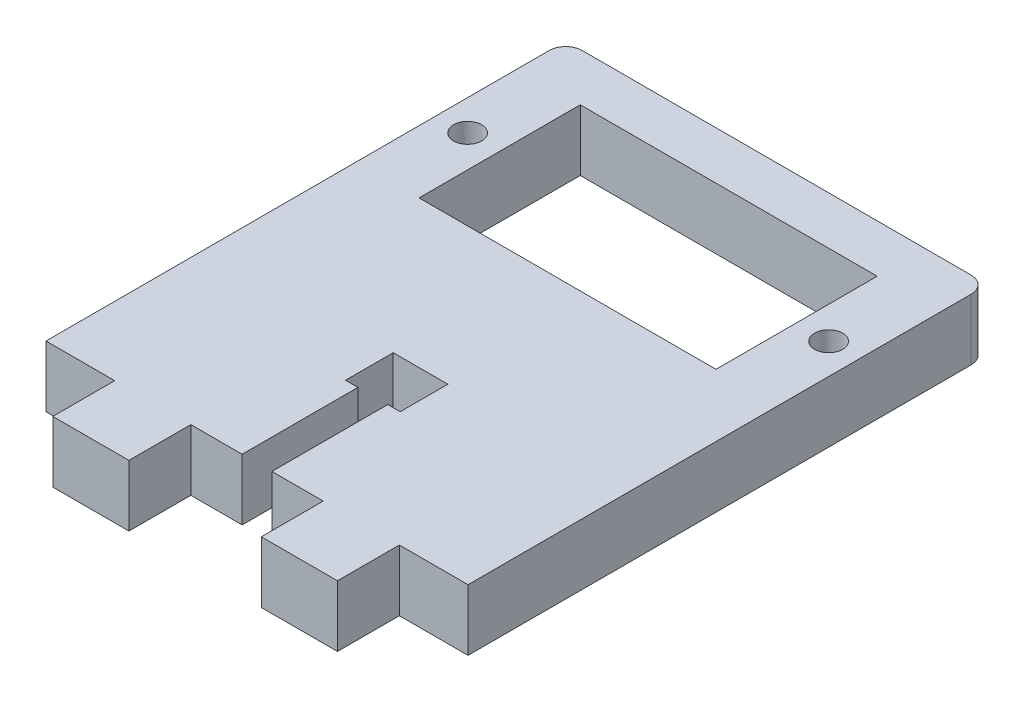
ISO-10303-21;
HEADER;
FILE_DESCRIPTION(('STEP AP214'),'2;1');
FILE_NAME('part.step','',(''),(''),'','','');
FILE_SCHEMA(('AUTOMOTIVE_DESIGN { 1 0 10303 214 1 1 1 1 }'));
ENDSEC;
DATA;
#1=APPLICATION_CONTEXT('core data for automotive mechanical design processes');
#2=APPLICATION_PROTOCOL_DEFINITION('international standard','automotive_design',2000,#1);
#3=PRODUCT_CONTEXT('',#1,'mechanical');
#4=PRODUCT('Part','Part','',(#3));
#5=PRODUCT_RELATED_PRODUCT_CATEGORY('part','',(#4));
#6=PRODUCT_DEFINITION_FORMATION('','',#4);
#7=PRODUCT_DEFINITION_CONTEXT('part definition',#1,'design');
#8=PRODUCT_DEFINITION('design','',#6,#7);
#9=PRODUCT_DEFINITION_SHAPE('','',#8);
#10=(LENGTH_UNIT() NAMED_UNIT(*) SI_UNIT(.MILLI.,.METRE.));
#11=(NAMED_UNIT(*) PLANE_ANGLE_UNIT() SI_UNIT($,.RADIAN.));
#12=(NAMED_UNIT(*) SI_UNIT($,.STERADIAN.) SOLID_ANGLE_UNIT());
#13=UNCERTAINTY_MEASURE_WITH_UNIT(LENGTH_MEASURE(1.E-05),#10,'distance_accuracy_value','');
#14=(GEOMETRIC_REPRESENTATION_CONTEXT(3) GLOBAL_UNCERTAINTY_ASSIGNED_CONTEXT((#13)) GLOBAL_UNIT_ASSIGNED_CONTEXT((#10,
#11,#12)) REPRESENTATION_CONTEXT('',''));
#15=CARTESIAN_POINT('',(0.,0.,0.));
#16=DIRECTION('',(0.,0.,1.));
#17=DIRECTION('',(1.,0.,0.));
#18=AXIS2_PLACEMENT_3D('',#15,#16,#17);
#19=CARTESIAN_POINT('',(-16.1925,4.699,19.939));
#20=DIRECTION('',(0.,0.,-1.));
#21=DIRECTION('',(-1.,0.,0.));
#22=AXIS2_PLACEMENT_3D('',#19,#20,#21);
#23=PLANE('',#22);
#24=DIRECTION('',(0.,1.,0.));
#25=VECTOR('',#24,1.);
#26=CARTESIAN_POINT('',(-1.143,0.,19.939));
#27=LINE('',#26,#25);
#28=CARTESIAN_POINT('',(-1.143,0.,19.939));
#29=VERTEX_POINT('',#28);
#30=CARTESIAN_POINT('',(-1.143,4.699,19.939));
#31=VERTEX_POINT('',#30);
#32=EDGE_CURVE('E370',#29,#31,#27,.T.);
#33=ORIENTED_EDGE('',*,*,#32,.T.);
#34=DIRECTION('',(1.,0.,0.));
#35=VECTOR('',#34,1.);
#36=CARTESIAN_POINT('',(-16.1925,4.699,19.939));
#37=LINE('',#36,#35);
#38=CARTESIAN_POINT('',(-5.08,4.699,19.939));
#39=VERTEX_POINT('',#38);
#40=EDGE_CURVE('E503',#39,#31,#37,.T.);
#41=ORIENTED_EDGE('',*,*,#40,.F.);
#42=DIRECTION('',(0.,-1.,0.));
#43=VECTOR('',#42,1.);
#44=CARTESIAN_POINT('',(-5.08,4.699,19.939));
#45=LINE('',#44,#43);
#46=CARTESIAN_POINT('',(-5.08,0.,19.939));
#47=VERTEX_POINT('',#46);
#48=EDGE_CURVE('E414',#39,#47,#45,.T.);
#49=ORIENTED_EDGE('',*,*,#48,.T.);
#50=DIRECTION('',(1.,0.,0.));
#51=VECTOR('',#50,1.);
#52=CARTESIAN_POINT('',(-16.1925,0.,19.939));
#53=LINE('',#52,#51);
#54=EDGE_CURVE('E521',#47,#29,#53,.T.);
#55=ORIENTED_EDGE('',*,*,#54,.T.);
#56=EDGE_LOOP('',(#33,#41,#49,#55));
#57=FACE_BOUND('',#56,.T.);
#58=ADVANCED_FACE('F110',(#57),#23,.F.);
#59=CARTESIAN_POINT('',(-10.922,4.699,0.));
#60=DIRECTION('',(1.,0.,0.));
#61=DIRECTION('',(0.,0.,-1.));
#62=AXIS2_PLACEMENT_3D('',#59,#60,#61);
#63=PLANE('',#62);
#64=DIRECTION('',(0.,0.,1.));
#65=VECTOR('',#64,1.);
#66=CARTESIAN_POINT('',(-10.922,0.,0.));
#67=LINE('',#66,#65);
#68=CARTESIAN_POINT('',(-10.922,0.,19.939));
#69=VERTEX_POINT('',#68);
#70=CARTESIAN_POINT('',(-10.922,0.,24.6888));
#71=VERTEX_POINT('',#70);
#72=EDGE_CURVE('E398',#69,#71,#67,.T.);
#73=ORIENTED_EDGE('',*,*,#72,.T.);
#74=DIRECTION('',(0.,-1.,0.));
#75=VECTOR('',#74,1.);
#76=CARTESIAN_POINT('',(-10.922,4.699,24.6888));
#77=LINE('',#76,#75);
#78=CARTESIAN_POINT('',(-10.922,4.699,24.6888));
#79=VERTEX_POINT('',#78);
#80=EDGE_CURVE('E407',#79,#71,#77,.T.);
#81=ORIENTED_EDGE('',*,*,#80,.F.);
#82=DIRECTION('',(0.,0.,1.));
#83=VECTOR('',#82,1.);
#84=CARTESIAN_POINT('',(-10.922,4.699,0.));
#85=LINE('',#84,#83);
#86=CARTESIAN_POINT('',(-10.922,4.699,19.939));
#87=VERTEX_POINT('',#86);
#88=EDGE_CURVE('E386',#87,#79,#85,.T.);
#89=ORIENTED_EDGE('',*,*,#88,.F.);
#90=DIRECTION('',(0.,-1.,0.));
#91=VECTOR('',#90,1.);
#92=CARTESIAN_POINT('',(-10.922,4.699,19.939));
#93=LINE('',#92,#91);
#94=EDGE_CURVE('E411',#87,#69,#93,.T.);
#95=ORIENTED_EDGE('',*,*,#94,.T.);
#96=EDGE_LOOP('',(#73,#81,#89,#95));
#97=FACE_BOUND('',#96,.T.);
#98=ADVANCED_FACE('F595',(#97),#63,.F.);
#99=CARTESIAN_POINT('',(0.,4.699,24.6888));
#100=DIRECTION('',(0.,0.,-1.));
#101=DIRECTION('',(-1.,0.,0.));
#102=AXIS2_PLACEMENT_3D('',#99,#100,#101);
#103=PLANE('',#102);
#104=DIRECTION('',(1.,0.,0.));
#105=VECTOR('',#104,1.);
#106=CARTESIAN_POINT('',(0.,0.,24.6888));
#107=LINE('',#106,#105);
#108=CARTESIAN_POINT('',(-5.08,0.,24.6888));
#109=VERTEX_POINT('',#108);
#110=EDGE_CURVE('E387',#71,#109,#107,.T.);
#111=ORIENTED_EDGE('',*,*,#110,.T.);
#112=DIRECTION('',(0.,-1.,0.));
#113=VECTOR('',#112,1.);
#114=CARTESIAN_POINT('',(-5.08,4.699,24.6888));
#115=LINE('',#114,#113);
#116=CARTESIAN_POINT('',(-5.08,4.699,24.6888));
#117=VERTEX_POINT('',#116);
#118=EDGE_CURVE('E393',#117,#109,#115,.T.);
#119=ORIENTED_EDGE('',*,*,#118,.F.);
#120=DIRECTION('',(1.,0.,0.));
#121=VECTOR('',#120,1.);
#122=CARTESIAN_POINT('',(0.,4.699,24.6888));
#123=LINE('',#122,#121);
#124=EDGE_CURVE('E390',#79,#117,#123,.T.);
#125=ORIENTED_EDGE('',*,*,#124,.F.);
#126=ORIENTED_EDGE('',*,*,#80,.T.);
#127=EDGE_LOOP('',(#111,#119,#125,#126));
#128=FACE_BOUND('',#127,.T.);
#129=ADVANCED_FACE('F589',(#128),#103,.F.);
#130=CARTESIAN_POINT('',(-5.08000000000001,4.699,0.));
#131=DIRECTION('',(1.,0.,0.));
#132=DIRECTION('',(0.,0.,-1.));
#133=AXIS2_PLACEMENT_3D('',#130,#131,#132);
#134=PLANE('',#133);
#135=DIRECTION('',(0.,0.,1.));
#136=VECTOR('',#135,1.);
#137=CARTESIAN_POINT('',(-5.08000000000001,0.,0.));
#138=LINE('',#137,#136);
#139=EDGE_CURVE('E394',#47,#109,#138,.T.);
#140=ORIENTED_EDGE('',*,*,#139,.F.);
#141=ORIENTED_EDGE('',*,*,#48,.F.);
#142=DIRECTION('',(0.,0.,1.));
#143=VECTOR('',#142,1.);
#144=CARTESIAN_POINT('',(-5.08000000000001,4.699,0.));
#145=LINE('',#144,#143);
#146=EDGE_CURVE('E382',#39,#117,#145,.T.);
#147=ORIENTED_EDGE('',*,*,#146,.T.);
#148=ORIENTED_EDGE('',*,*,#118,.T.);
#149=EDGE_LOOP('',(#140,#141,#147,#148));
#150=FACE_BOUND('',#149,.T.);
#151=ADVANCED_FACE('F584',(#150),#134,.T.);
#152=CARTESIAN_POINT('',(0.,0.,0.));
#153=DIRECTION('',(0.,1.,0.));
#154=DIRECTION('',(0.,0.,1.));
#155=AXIS2_PLACEMENT_3D('',#152,#153,#154);
#156=PLANE('',#155);
#157=CARTESIAN_POINT('',(13.85062,0.,-10.0711));
#158=DIRECTION('',(0.,1.,0.));
#159=DIRECTION('',(0.,0.,1.));
#160=AXIS2_PLACEMENT_3D('',#157,#158,#159);
#161=CIRCLE('',#160,1.0795);
#162=CARTESIAN_POINT('',(13.85062,0.,-8.99160000000001));
#163=VERTEX_POINT('',#162);
#164=EDGE_CURVE('E344',#163,#163,#161,.T.);
#165=ORIENTED_EDGE('',*,*,#164,.T.);
#166=EDGE_LOOP('',(#165));
#167=FACE_BOUND('',#166,.T.);
#168=CARTESIAN_POINT('',(-13.85062,0.,-10.0711));
#169=DIRECTION('',(0.,1.,0.));
#170=DIRECTION('',(0.,0.,1.));
#171=AXIS2_PLACEMENT_3D('',#168,#169,#170);
#172=CIRCLE('',#171,1.0795);
#173=CARTESIAN_POINT('',(-13.85062,0.,-8.99160000000001));
#174=VERTEX_POINT('',#173);
#175=EDGE_CURVE('E326',#174,#174,#172,.T.);
#176=ORIENTED_EDGE('',*,*,#175,.T.);
#177=EDGE_LOOP('',(#176));
#178=FACE_BOUND('',#177,.T.);
#179=DIRECTION('',(1.,0.,0.));
#180=VECTOR('',#179,1.);
#181=CARTESIAN_POINT('',(-16.1925,0.,-19.939));
#182=LINE('',#181,#180);
#183=CARTESIAN_POINT('',(-14.9225,0.,-19.939));
#184=VERTEX_POINT('',#183);
#185=CARTESIAN_POINT('',(14.9225,0.,-19.939));
#186=VERTEX_POINT('',#185);
#187=EDGE_CURVE('E525',#184,#186,#182,.T.);
#188=ORIENTED_EDGE('',*,*,#187,.T.);
#189=CARTESIAN_POINT('',(14.9225,0.,-18.669));
#190=DIRECTION('',(0.,1.,0.));
#191=DIRECTION('',(0.,0.,1.));
#192=AXIS2_PLACEMENT_3D('',#189,#190,#191);
#193=CIRCLE('',#192,1.27);
#194=CARTESIAN_POINT('',(16.1925,0.,-18.669));
#195=VERTEX_POINT('',#194);
#196=EDGE_CURVE('E546',#186,#195,#193,.F.);
#197=ORIENTED_EDGE('',*,*,#196,.T.);
#198=DIRECTION('',(0.,0.,-1.));
#199=VECTOR('',#198,1.);
#200=CARTESIAN_POINT('',(16.1925,0.,19.939));
#201=LINE('',#200,#199);
#202=CARTESIAN_POINT('',(16.1925,0.,19.939));
#203=VERTEX_POINT('',#202);
#204=EDGE_CURVE('E520',#203,#195,#201,.T.);
#205=ORIENTED_EDGE('',*,*,#204,.F.);
#206=CARTESIAN_POINT('',(10.922,0.,19.939));
#207=VERTEX_POINT('',#206);
#208=EDGE_CURVE('E497',#207,#203,#53,.T.);
#209=ORIENTED_EDGE('',*,*,#208,.F.);
#210=DIRECTION('',(0.,0.,1.));
#211=VECTOR('',#210,1.);
#212=CARTESIAN_POINT('',(10.922,0.,0.));
#213=LINE('',#212,#211);
#214=CARTESIAN_POINT('',(10.922,0.,24.6888));
#215=VERTEX_POINT('',#214);
#216=EDGE_CURVE('E422',#207,#215,#213,.T.);
#217=ORIENTED_EDGE('',*,*,#216,.T.);
#218=DIRECTION('',(-1.,0.,0.));
#219=VECTOR('',#218,1.);
#220=CARTESIAN_POINT('',(0.,0.,24.6888));
#221=LINE('',#220,#219);
#222=CARTESIAN_POINT('',(5.08,0.,24.6888));
#223=VERTEX_POINT('',#222);
#224=EDGE_CURVE('E435',#215,#223,#221,.T.);
#225=ORIENTED_EDGE('',*,*,#224,.T.);
#226=DIRECTION('',(0.,0.,1.));
#227=VECTOR('',#226,1.);
#228=CARTESIAN_POINT('',(5.08000000000001,0.,0.));
#229=LINE('',#228,#227);
#230=CARTESIAN_POINT('',(5.08,0.,19.939));
#231=VERTEX_POINT('',#230);
#232=EDGE_CURVE('E431',#231,#223,#229,.T.);
#233=ORIENTED_EDGE('',*,*,#232,.F.);
#234=CARTESIAN_POINT('',(1.143,0.,19.939));
#235=VERTEX_POINT('',#234);
#236=EDGE_CURVE('E522',#235,#231,#53,.T.);
#237=ORIENTED_EDGE('',*,*,#236,.F.);
#238=DIRECTION('',(0.,0.,-1.));
#239=VECTOR('',#238,1.);
#240=CARTESIAN_POINT('',(1.143,0.,0.));
#241=LINE('',#240,#239);
#242=CARTESIAN_POINT('',(1.143,0.,11.049));
#243=VERTEX_POINT('',#242);
#244=EDGE_CURVE('E338',#235,#243,#241,.T.);
#245=ORIENTED_EDGE('',*,*,#244,.T.);
#246=DIRECTION('',(1.,0.,0.));
#247=VECTOR('',#246,1.);
#248=CARTESIAN_POINT('',(0.,0.,11.049));
#249=LINE('',#248,#247);
#250=CARTESIAN_POINT('',(2.0955,0.,11.049));
#251=VERTEX_POINT('',#250);
#252=EDGE_CURVE('E309',#243,#251,#249,.T.);
#253=ORIENTED_EDGE('',*,*,#252,.T.);
#254=DIRECTION('',(0.,0.,1.));
#255=VECTOR('',#254,1.);
#256=CARTESIAN_POINT('',(2.09549999999999,0.,0.));
#257=LINE('',#256,#255);
#258=CARTESIAN_POINT('',(2.0955,0.,7.39139999999999));
#259=VERTEX_POINT('',#258);
#260=EDGE_CURVE('E300',#259,#251,#257,.T.);
#261=ORIENTED_EDGE('',*,*,#260,.F.);
#262=DIRECTION('',(1.,0.,0.));
#263=VECTOR('',#262,1.);
#264=CARTESIAN_POINT('',(0.,0.,7.39139999999999));
#265=LINE('',#264,#263);
#266=CARTESIAN_POINT('',(-2.0955,0.,7.39139999999999));
#267=VERTEX_POINT('',#266);
#268=EDGE_CURVE('E287',#267,#259,#265,.T.);
#269=ORIENTED_EDGE('',*,*,#268,.F.);
#270=DIRECTION('',(0.,0.,1.));
#271=VECTOR('',#270,1.);
#272=CARTESIAN_POINT('',(-2.0955,0.,0.));
#273=LINE('',#272,#271);
#274=CARTESIAN_POINT('',(-2.0955,0.,11.049));
#275=VERTEX_POINT('',#274);
#276=EDGE_CURVE('E299',#267,#275,#273,.T.);
#277=ORIENTED_EDGE('',*,*,#276,.T.);
#278=CARTESIAN_POINT('',(-1.143,0.,11.049));
#279=VERTEX_POINT('',#278);
#280=EDGE_CURVE('E331',#275,#279,#249,.T.);
#281=ORIENTED_EDGE('',*,*,#280,.T.);
#282=DIRECTION('',(0.,0.,-1.));
#283=VECTOR('',#282,1.);
#284=CARTESIAN_POINT('',(-1.14300000000001,0.,0.));
#285=LINE('',#284,#283);
#286=EDGE_CURVE('E335',#29,#279,#285,.T.);
#287=ORIENTED_EDGE('',*,*,#286,.F.);
#288=ORIENTED_EDGE('',*,*,#54,.F.);
#289=ORIENTED_EDGE('',*,*,#139,.T.);
#290=ORIENTED_EDGE('',*,*,#110,.F.);
#291=ORIENTED_EDGE('',*,*,#72,.F.);
#292=CARTESIAN_POINT('',(-16.1925,0.,19.939));
#293=VERTEX_POINT('',#292);
#294=EDGE_CURVE('E516',#293,#69,#53,.T.);
#295=ORIENTED_EDGE('',*,*,#294,.F.);
#296=DIRECTION('',(0.,0.,-1.));
#297=VECTOR('',#296,1.);
#298=CARTESIAN_POINT('',(-16.1925,0.,19.939));
#299=LINE('',#298,#297);
#300=CARTESIAN_POINT('',(-16.1925,0.,-18.669));
#301=VERTEX_POINT('',#300);
#302=EDGE_CURVE('E528',#293,#301,#299,.T.);
#303=ORIENTED_EDGE('',*,*,#302,.T.);
#304=CARTESIAN_POINT('',(-14.9225,0.,-18.669));
#305=DIRECTION('',(0.,1.,0.));
#306=DIRECTION('',(0.,0.,1.));
#307=AXIS2_PLACEMENT_3D('',#304,#305,#306);
#308=CIRCLE('',#307,1.27);
#309=EDGE_CURVE('E543',#301,#184,#308,.F.);
#310=ORIENTED_EDGE('',*,*,#309,.T.);
#311=EDGE_LOOP('',(#188,#197,#205,#209,#217,#225,#233,#237,#245,#253,#261,#269,#277,#281,#287,
#288,#289,#290,#291,#295,#303,#310));
#312=FACE_BOUND('',#311,.T.);
#313=DIRECTION('',(1.,0.,0.));
#314=VECTOR('',#313,1.);
#315=CARTESIAN_POINT('',(0.,0.,-3.88620000000001));
#316=LINE('',#315,#314);
#317=CARTESIAN_POINT('',(-11.3919,0.,-3.88620000000001));
#318=VERTEX_POINT('',#317);
#319=CARTESIAN_POINT('',(11.3919,0.,-3.88620000000001));
#320=VERTEX_POINT('',#319);
#321=EDGE_CURVE('E363',#318,#320,#316,.T.);
#322=ORIENTED_EDGE('',*,*,#321,.T.);
#323=DIRECTION('',(0.,0.,-1.));
#324=VECTOR('',#323,1.);
#325=CARTESIAN_POINT('',(11.3919,0.,0.));
#326=LINE('',#325,#324);
#327=CARTESIAN_POINT('',(11.3919,0.,-16.256));
#328=VERTEX_POINT('',#327);
#329=EDGE_CURVE('E473',#320,#328,#326,.T.);
#330=ORIENTED_EDGE('',*,*,#329,.T.);
#331=DIRECTION('',(1.,0.,0.));
#332=VECTOR('',#331,1.);
#333=CARTESIAN_POINT('',(0.,0.,-16.256));
#334=LINE('',#333,#332);
#335=CARTESIAN_POINT('',(-11.3919,0.,-16.256));
#336=VERTEX_POINT('',#335);
#337=EDGE_CURVE('E477',#336,#328,#334,.T.);
#338=ORIENTED_EDGE('',*,*,#337,.F.);
#339=DIRECTION('',(0.,0.,-1.));
#340=VECTOR('',#339,1.);
#341=CARTESIAN_POINT('',(-11.3919,0.,0.));
#342=LINE('',#341,#340);
#343=EDGE_CURVE('E458',#318,#336,#342,.T.);
#344=ORIENTED_EDGE('',*,*,#343,.F.);
#345=EDGE_LOOP('',(#322,#330,#338,#344));
#346=FACE_BOUND('',#345,.T.);
#347=ADVANCED_FACE('F313',(#167,#178,#312,#346),#156,.F.);
#348=CARTESIAN_POINT('',(0.,4.699,0.));
#349=DIRECTION('',(0.,1.,0.));
#350=DIRECTION('',(0.,0.,1.));
#351=AXIS2_PLACEMENT_3D('',#348,#349,#350);
#352=PLANE('',#351);
#353=CARTESIAN_POINT('',(13.85062,4.699,-10.0711));
#354=DIRECTION('',(0.,1.,0.));
#355=DIRECTION('',(0.,0.,1.));
#356=AXIS2_PLACEMENT_3D('',#353,#354,#355);
#357=CIRCLE('',#356,1.0795);
#358=CARTESIAN_POINT('',(13.85062,4.699,-8.99160000000001));
#359=VERTEX_POINT('',#358);
#360=EDGE_CURVE('E883',#359,#359,#357,.T.);
#361=ORIENTED_EDGE('',*,*,#360,.F.);
#362=EDGE_LOOP('',(#361));
#363=FACE_BOUND('',#362,.T.);
#364=CARTESIAN_POINT('',(-13.85062,4.699,-10.0711));
#365=DIRECTION('',(0.,1.,0.));
#366=DIRECTION('',(0.,0.,1.));
#367=AXIS2_PLACEMENT_3D('',#364,#365,#366);
#368=CIRCLE('',#367,1.0795);
#369=CARTESIAN_POINT('',(-13.85062,4.699,-8.99160000000001));
#370=VERTEX_POINT('',#369);
#371=EDGE_CURVE('E885',#370,#370,#368,.T.);
#372=ORIENTED_EDGE('',*,*,#371,.F.);
#373=EDGE_LOOP('',(#372));
#374=FACE_BOUND('',#373,.T.);
#375=DIRECTION('',(0.,0.,-1.));
#376=VECTOR('',#375,1.);
#377=CARTESIAN_POINT('',(16.1925,4.699,19.939));
#378=LINE('',#377,#376);
#379=CARTESIAN_POINT('',(16.1925,4.699,19.939));
#380=VERTEX_POINT('',#379);
#381=CARTESIAN_POINT('',(16.1925,4.699,-18.669));
#382=VERTEX_POINT('',#381);
#383=EDGE_CURVE('E502',#380,#382,#378,.T.);
#384=ORIENTED_EDGE('',*,*,#383,.T.);
#385=CARTESIAN_POINT('',(14.9225,4.699,-18.669));
#386=DIRECTION('',(0.,1.,0.));
#387=DIRECTION('',(0.,0.,1.));
#388=AXIS2_PLACEMENT_3D('',#385,#386,#387);
#389=CIRCLE('',#388,1.27);
#390=CARTESIAN_POINT('',(14.9225,4.699,-19.939));
#391=VERTEX_POINT('',#390);
#392=EDGE_CURVE('E119',#382,#391,#389,.T.);
#393=ORIENTED_EDGE('',*,*,#392,.T.);
#394=DIRECTION('',(1.,0.,0.));
#395=VECTOR('',#394,1.);
#396=CARTESIAN_POINT('',(-16.1925,4.699,-19.939));
#397=LINE('',#396,#395);
#398=CARTESIAN_POINT('',(-14.9225,4.699,-19.939));
#399=VERTEX_POINT('',#398);
#400=EDGE_CURVE('E508',#399,#391,#397,.T.);
#401=ORIENTED_EDGE('',*,*,#400,.F.);
#402=CARTESIAN_POINT('',(-14.9225,4.699,-18.669));
#403=DIRECTION('',(0.,1.,0.));
#404=DIRECTION('',(0.,0.,1.));
#405=AXIS2_PLACEMENT_3D('',#402,#403,#404);
#406=CIRCLE('',#405,1.27);
#407=CARTESIAN_POINT('',(-16.1925,4.699,-18.669));
#408=VERTEX_POINT('',#407);
#409=EDGE_CURVE('E126',#399,#408,#406,.T.);
#410=ORIENTED_EDGE('',*,*,#409,.T.);
#411=DIRECTION('',(0.,0.,-1.));
#412=VECTOR('',#411,1.);
#413=CARTESIAN_POINT('',(-16.1925,4.699,19.939));
#414=LINE('',#413,#412);
#415=CARTESIAN_POINT('',(-16.1925,4.699,19.939));
#416=VERTEX_POINT('',#415);
#417=EDGE_CURVE('E512',#416,#408,#414,.T.);
#418=ORIENTED_EDGE('',*,*,#417,.F.);
#419=EDGE_CURVE('E498',#416,#87,#37,.T.);
#420=ORIENTED_EDGE('',*,*,#419,.T.);
#421=ORIENTED_EDGE('',*,*,#88,.T.);
#422=ORIENTED_EDGE('',*,*,#124,.T.);
#423=ORIENTED_EDGE('',*,*,#146,.F.);
#424=ORIENTED_EDGE('',*,*,#40,.T.);
#425=DIRECTION('',(0.,0.,-1.));
#426=VECTOR('',#425,1.);
#427=CARTESIAN_POINT('',(-1.14300000000001,4.699,0.));
#428=LINE('',#427,#426);
#429=CARTESIAN_POINT('',(-1.143,4.699,11.049));
#430=VERTEX_POINT('',#429);
#431=EDGE_CURVE('E353',#31,#430,#428,.T.);
#432=ORIENTED_EDGE('',*,*,#431,.T.);
#433=DIRECTION('',(1.,0.,0.));
#434=VECTOR('',#433,1.);
#435=CARTESIAN_POINT('',(0.,4.699,11.049));
#436=LINE('',#435,#434);
#437=CARTESIAN_POINT('',(-2.0955,4.699,11.049));
#438=VERTEX_POINT('',#437);
#439=EDGE_CURVE('E324',#438,#430,#436,.T.);
#440=ORIENTED_EDGE('',*,*,#439,.F.);
#441=DIRECTION('',(0.,0.,1.));
#442=VECTOR('',#441,1.);
#443=CARTESIAN_POINT('',(-2.0955,4.699,0.));
#444=LINE('',#443,#442);
#445=CARTESIAN_POINT('',(-2.0955,4.699,7.39139999999999));
#446=VERTEX_POINT('',#445);
#447=EDGE_CURVE('E347',#446,#438,#444,.T.);
#448=ORIENTED_EDGE('',*,*,#447,.F.);
#449=DIRECTION('',(1.,0.,0.));
#450=VECTOR('',#449,1.);
#451=CARTESIAN_POINT('',(0.,4.699,7.39139999999999));
#452=LINE('',#451,#450);
#453=CARTESIAN_POINT('',(2.0955,4.699,7.39139999999999));
#454=VERTEX_POINT('',#453);
#455=EDGE_CURVE('E343',#446,#454,#452,.T.);
#456=ORIENTED_EDGE('',*,*,#455,.T.);
#457=DIRECTION('',(0.,0.,1.));
#458=VECTOR('',#457,1.);
#459=CARTESIAN_POINT('',(2.09549999999999,4.699,0.));
#460=LINE('',#459,#458);
#461=CARTESIAN_POINT('',(2.0955,4.699,11.049));
#462=VERTEX_POINT('',#461);
#463=EDGE_CURVE('E306',#454,#462,#460,.T.);
#464=ORIENTED_EDGE('',*,*,#463,.T.);
#465=CARTESIAN_POINT('',(1.143,4.699,11.049));
#466=VERTEX_POINT('',#465);
#467=EDGE_CURVE('E318',#466,#462,#436,.T.);
#468=ORIENTED_EDGE('',*,*,#467,.F.);
#469=DIRECTION('',(0.,0.,-1.));
#470=VECTOR('',#469,1.);
#471=CARTESIAN_POINT('',(1.143,4.699,0.));
#472=LINE('',#471,#470);
#473=CARTESIAN_POINT('',(1.143,4.699,19.939));
#474=VERTEX_POINT('',#473);
#475=EDGE_CURVE('E322',#474,#466,#472,.T.);
#476=ORIENTED_EDGE('',*,*,#475,.F.);
#477=CARTESIAN_POINT('',(5.08,4.699,19.939));
#478=VERTEX_POINT('',#477);
#479=EDGE_CURVE('E504',#474,#478,#37,.T.);
#480=ORIENTED_EDGE('',*,*,#479,.T.);
#481=DIRECTION('',(0.,0.,1.));
#482=VECTOR('',#481,1.);
#483=CARTESIAN_POINT('',(5.08000000000001,4.699,0.));
#484=LINE('',#483,#482);
#485=CARTESIAN_POINT('',(5.08,4.699,24.6888));
#486=VERTEX_POINT('',#485);
#487=EDGE_CURVE('E418',#478,#486,#484,.T.);
#488=ORIENTED_EDGE('',*,*,#487,.T.);
#489=DIRECTION('',(-1.,0.,0.));
#490=VECTOR('',#489,1.);
#491=CARTESIAN_POINT('',(0.,4.699,24.6888));
#492=LINE('',#491,#490);
#493=CARTESIAN_POINT('',(10.922,4.699,24.6888));
#494=VERTEX_POINT('',#493);
#495=EDGE_CURVE('E421',#494,#486,#492,.T.);
#496=ORIENTED_EDGE('',*,*,#495,.F.);
#497=DIRECTION('',(0.,0.,1.));
#498=VECTOR('',#497,1.);
#499=CARTESIAN_POINT('',(10.922,4.699,0.));
#500=LINE('',#499,#498);
#501=CARTESIAN_POINT('',(10.922,4.699,19.939));
#502=VERTEX_POINT('',#501);
#503=EDGE_CURVE('E426',#502,#494,#500,.T.);
#504=ORIENTED_EDGE('',*,*,#503,.F.);
#505=EDGE_CURVE('E505',#502,#380,#37,.T.);
#506=ORIENTED_EDGE('',*,*,#505,.T.);
#507=EDGE_LOOP('',(#384,#393,#401,#410,#418,#420,#421,#422,#423,#424,#432,#440,#448,#456,#464,
#468,#476,#480,#488,#496,#504,#506));
#508=FACE_BOUND('',#507,.T.);
#509=DIRECTION('',(0.,0.,-1.));
#510=VECTOR('',#509,1.);
#511=CARTESIAN_POINT('',(11.3919,4.699,0.));
#512=LINE('',#511,#510);
#513=CARTESIAN_POINT('',(11.3919,4.699,-3.88620000000001));
#514=VERTEX_POINT('',#513);
#515=CARTESIAN_POINT('',(11.3919,4.699,-16.256));
#516=VERTEX_POINT('',#515);
#517=EDGE_CURVE('E457',#514,#516,#512,.T.);
#518=ORIENTED_EDGE('',*,*,#517,.F.);
#519=DIRECTION('',(1.,0.,0.));
#520=VECTOR('',#519,1.);
#521=CARTESIAN_POINT('',(0.,4.699,-3.88620000000001));
#522=LINE('',#521,#520);
#523=CARTESIAN_POINT('',(-11.3919,4.699,-3.88620000000001));
#524=VERTEX_POINT('',#523);
#525=EDGE_CURVE('E454',#524,#514,#522,.T.);
#526=ORIENTED_EDGE('',*,*,#525,.F.);
#527=DIRECTION('',(0.,0.,-1.));
#528=VECTOR('',#527,1.);
#529=CARTESIAN_POINT('',(-11.3919,4.699,0.));
#530=LINE('',#529,#528);
#531=CARTESIAN_POINT('',(-11.3919,4.699,-16.256));
#532=VERTEX_POINT('',#531);
#533=EDGE_CURVE('E465',#524,#532,#530,.T.);
#534=ORIENTED_EDGE('',*,*,#533,.T.);
#535=DIRECTION('',(1.,0.,0.));
#536=VECTOR('',#535,1.);
#537=CARTESIAN_POINT('',(0.,4.699,-16.256));
#538=LINE('',#537,#536);
#539=EDGE_CURVE('E461',#532,#516,#538,.T.);
#540=ORIENTED_EDGE('',*,*,#539,.T.);
#541=EDGE_LOOP('',(#518,#526,#534,#540));
#542=FACE_BOUND('',#541,.T.);
#543=ADVANCED_FACE('F554',(#363,#374,#508,#542),#352,.T.);
#544=CARTESIAN_POINT('',(0.,4.699,24.6888));
#545=DIRECTION('',(0.,0.,1.));
#546=DIRECTION('',(1.,0.,0.));
#547=AXIS2_PLACEMENT_3D('',#544,#545,#546);
#548=PLANE('',#547);
#549=ORIENTED_EDGE('',*,*,#224,.F.);
#550=DIRECTION('',(0.,-1.,0.));
#551=VECTOR('',#550,1.);
#552=CARTESIAN_POINT('',(10.922,4.699,24.6888));
#553=LINE('',#552,#551);
#554=EDGE_CURVE('E445',#494,#215,#553,.T.);
#555=ORIENTED_EDGE('',*,*,#554,.F.);
#556=ORIENTED_EDGE('',*,*,#495,.T.);
#557=DIRECTION('',(0.,-1.,0.));
#558=VECTOR('',#557,1.);
#559=CARTESIAN_POINT('',(5.08,4.699,24.6888));
#560=LINE('',#559,#558);
#561=EDGE_CURVE('E448',#486,#223,#560,.T.);
#562=ORIENTED_EDGE('',*,*,#561,.T.);
#563=EDGE_LOOP('',(#549,#555,#556,#562));
#564=FACE_BOUND('',#563,.T.);
#565=ADVANCED_FACE('F634',(#564),#548,.T.);
#566=CARTESIAN_POINT('',(10.922,4.699,0.));
#567=DIRECTION('',(1.,0.,0.));
#568=DIRECTION('',(0.,0.,-1.));
#569=AXIS2_PLACEMENT_3D('',#566,#567,#568);
#570=PLANE('',#569);
#571=ORIENTED_EDGE('',*,*,#216,.F.);
#572=DIRECTION('',(0.,-1.,0.));
#573=VECTOR('',#572,1.);
#574=CARTESIAN_POINT('',(10.922,4.699,19.939));
#575=LINE('',#574,#573);
#576=EDGE_CURVE('E430',#502,#207,#575,.T.);
#577=ORIENTED_EDGE('',*,*,#576,.F.);
#578=ORIENTED_EDGE('',*,*,#503,.T.);
#579=ORIENTED_EDGE('',*,*,#554,.T.);
#580=EDGE_LOOP('',(#571,#577,#578,#579));
#581=FACE_BOUND('',#580,.T.);
#582=ADVANCED_FACE('F642',(#581),#570,.T.);
#583=CARTESIAN_POINT('',(5.08000000000001,4.699,0.));
#584=DIRECTION('',(1.,0.,0.));
#585=DIRECTION('',(0.,0.,-1.));
#586=AXIS2_PLACEMENT_3D('',#583,#584,#585);
#587=PLANE('',#586);
#588=ORIENTED_EDGE('',*,*,#232,.T.);
#589=ORIENTED_EDGE('',*,*,#561,.F.);
#590=ORIENTED_EDGE('',*,*,#487,.F.);
#591=DIRECTION('',(0.,-1.,0.));
#592=VECTOR('',#591,1.);
#593=CARTESIAN_POINT('',(5.08,4.699,19.939));
#594=LINE('',#593,#592);
#595=EDGE_CURVE('E399',#478,#231,#594,.T.);
#596=ORIENTED_EDGE('',*,*,#595,.T.);
#597=EDGE_LOOP('',(#588,#589,#590,#596));
#598=FACE_BOUND('',#597,.T.);
#599=ADVANCED_FACE('F645',(#598),#587,.F.);
#600=CARTESIAN_POINT('',(-11.3919,4.699,0.));
#601=DIRECTION('',(-1.,0.,0.));
#602=DIRECTION('',(0.,0.,1.));
#603=AXIS2_PLACEMENT_3D('',#600,#601,#602);
#604=PLANE('',#603);
#605=ORIENTED_EDGE('',*,*,#343,.T.);
#606=DIRECTION('',(0.,-1.,0.));
#607=VECTOR('',#606,1.);
#608=CARTESIAN_POINT('',(-11.3919,4.699,-16.256));
#609=LINE('',#608,#607);
#610=EDGE_CURVE('E487',#532,#336,#609,.T.);
#611=ORIENTED_EDGE('',*,*,#610,.F.);
#612=ORIENTED_EDGE('',*,*,#533,.F.);
#613=DIRECTION('',(0.,-1.,0.));
#614=VECTOR('',#613,1.);
#615=CARTESIAN_POINT('',(-11.3919,4.699,-3.88620000000001));
#616=LINE('',#615,#614);
#617=EDGE_CURVE('E469',#524,#318,#616,.T.);
#618=ORIENTED_EDGE('',*,*,#617,.T.);
#619=EDGE_LOOP('',(#605,#611,#612,#618));
#620=FACE_BOUND('',#619,.T.);
#621=ADVANCED_FACE('F662',(#620),#604,.F.);
#622=CARTESIAN_POINT('',(0.,4.699,-16.256));
#623=DIRECTION('',(0.,0.,-1.));
#624=DIRECTION('',(-1.,0.,0.));
#625=AXIS2_PLACEMENT_3D('',#622,#623,#624);
#626=PLANE('',#625);
#627=ORIENTED_EDGE('',*,*,#337,.T.);
#628=DIRECTION('',(0.,-1.,0.));
#629=VECTOR('',#628,1.);
#630=CARTESIAN_POINT('',(11.3919,4.699,-16.256));
#631=LINE('',#630,#629);
#632=EDGE_CURVE('E490',#516,#328,#631,.T.);
#633=ORIENTED_EDGE('',*,*,#632,.F.);
#634=ORIENTED_EDGE('',*,*,#539,.F.);
#635=ORIENTED_EDGE('',*,*,#610,.T.);
#636=EDGE_LOOP('',(#627,#633,#634,#635));
#637=FACE_BOUND('',#636,.T.);
#638=ADVANCED_FACE('F666',(#637),#626,.F.);
#639=CARTESIAN_POINT('',(11.3919,4.699,0.));
#640=DIRECTION('',(-1.,0.,0.));
#641=DIRECTION('',(0.,0.,1.));
#642=AXIS2_PLACEMENT_3D('',#639,#640,#641);
#643=PLANE('',#642);
#644=ORIENTED_EDGE('',*,*,#329,.F.);
#645=DIRECTION('',(0.,-1.,0.));
#646=VECTOR('',#645,1.);
#647=CARTESIAN_POINT('',(11.3919,4.699,-3.88620000000001));
#648=LINE('',#647,#646);
#649=EDGE_CURVE('E493',#514,#320,#648,.T.);
#650=ORIENTED_EDGE('',*,*,#649,.F.);
#651=ORIENTED_EDGE('',*,*,#517,.T.);
#652=ORIENTED_EDGE('',*,*,#632,.T.);
#653=EDGE_LOOP('',(#644,#650,#651,#652));
#654=FACE_BOUND('',#653,.T.);
#655=ADVANCED_FACE('F629',(#654),#643,.T.);
#656=CARTESIAN_POINT('',(0.,4.699,-3.88620000000001));
#657=DIRECTION('',(0.,0.,-1.));
#658=DIRECTION('',(-1.,0.,0.));
#659=AXIS2_PLACEMENT_3D('',#656,#657,#658);
#660=PLANE('',#659);
#661=ORIENTED_EDGE('',*,*,#321,.F.);
#662=ORIENTED_EDGE('',*,*,#617,.F.);
#663=ORIENTED_EDGE('',*,*,#525,.T.);
#664=ORIENTED_EDGE('',*,*,#649,.T.);
#665=EDGE_LOOP('',(#661,#662,#663,#664));
#666=FACE_BOUND('',#665,.T.);
#667=ADVANCED_FACE('F623',(#666),#660,.T.);
#668=ORIENTED_EDGE('',*,*,#479,.F.);
#669=DIRECTION('',(0.,1.,0.));
#670=VECTOR('',#669,1.);
#671=CARTESIAN_POINT('',(1.143,0.,19.939));
#672=LINE('',#671,#670);
#673=EDGE_CURVE('E367',#235,#474,#672,.T.);
#674=ORIENTED_EDGE('',*,*,#673,.F.);
#675=ORIENTED_EDGE('',*,*,#236,.T.);
#676=ORIENTED_EDGE('',*,*,#595,.F.);
#677=EDGE_LOOP('',(#668,#674,#675,#676));
#678=FACE_BOUND('',#677,.T.);
#679=ADVANCED_FACE('F615',(#678),#23,.F.);
#680=ORIENTED_EDGE('',*,*,#505,.F.);
#681=ORIENTED_EDGE('',*,*,#576,.T.);
#682=ORIENTED_EDGE('',*,*,#208,.T.);
#683=DIRECTION('',(0.,-1.,0.));
#684=VECTOR('',#683,1.);
#685=CARTESIAN_POINT('',(16.1925,4.699,19.939));
#686=LINE('',#685,#684);
#687=EDGE_CURVE('E436',#380,#203,#686,.T.);
#688=ORIENTED_EDGE('',*,*,#687,.F.);
#689=EDGE_LOOP('',(#680,#681,#682,#688));
#690=FACE_BOUND('',#689,.T.);
#691=ADVANCED_FACE('F569',(#690),#23,.F.);
#692=CARTESIAN_POINT('',(16.1925,4.699,19.939));
#693=DIRECTION('',(-1.,0.,0.));
#694=DIRECTION('',(0.,0.,1.));
#695=AXIS2_PLACEMENT_3D('',#692,#693,#694);
#696=PLANE('',#695);
#697=ORIENTED_EDGE('',*,*,#204,.T.);
#698=DIRECTION('',(0.,-1.,0.));
#699=VECTOR('',#698,1.);
#700=CARTESIAN_POINT('',(16.1925,4.699,-18.669));
#701=LINE('',#700,#699);
#702=EDGE_CURVE('E134',#195,#382,#701,.F.);
#703=ORIENTED_EDGE('',*,*,#702,.T.);
#704=ORIENTED_EDGE('',*,*,#383,.F.);
#705=ORIENTED_EDGE('',*,*,#687,.T.);
#706=EDGE_LOOP('',(#697,#703,#704,#705));
#707=FACE_BOUND('',#706,.T.);
#708=ADVANCED_FACE('F565',(#707),#696,.F.);
#709=CARTESIAN_POINT('',(-16.1925,4.699,-19.939));
#710=DIRECTION('',(0.,0.,-1.));
#711=DIRECTION('',(-1.,0.,0.));
#712=AXIS2_PLACEMENT_3D('',#709,#710,#711);
#713=PLANE('',#712);
#714=ORIENTED_EDGE('',*,*,#400,.T.);
#715=DIRECTION('',(0.,-1.,0.));
#716=VECTOR('',#715,1.);
#717=CARTESIAN_POINT('',(14.9225,0.,-19.939));
#718=LINE('',#717,#716);
#719=EDGE_CURVE('E539',#391,#186,#718,.T.);
#720=ORIENTED_EDGE('',*,*,#719,.T.);
#721=ORIENTED_EDGE('',*,*,#187,.F.);
#722=DIRECTION('',(0.,-1.,0.));
#723=VECTOR('',#722,1.);
#724=CARTESIAN_POINT('',(-14.9225,4.699,-19.939));
#725=LINE('',#724,#723);
#726=EDGE_CURVE('E417',#184,#399,#725,.F.);
#727=ORIENTED_EDGE('',*,*,#726,.T.);
#728=EDGE_LOOP('',(#714,#720,#721,#727));
#729=FACE_BOUND('',#728,.T.);
#730=ADVANCED_FACE('F559',(#729),#713,.T.);
#731=CARTESIAN_POINT('',(-16.1925,4.699,19.939));
#732=DIRECTION('',(-1.,0.,0.));
#733=DIRECTION('',(0.,0.,1.));
#734=AXIS2_PLACEMENT_3D('',#731,#732,#733);
#735=PLANE('',#734);
#736=ORIENTED_EDGE('',*,*,#417,.T.);
#737=DIRECTION('',(0.,-1.,0.));
#738=VECTOR('',#737,1.);
#739=CARTESIAN_POINT('',(-16.1925,4.699,-18.669));
#740=LINE('',#739,#738);
#741=EDGE_CURVE('E12',#408,#301,#740,.T.);
#742=ORIENTED_EDGE('',*,*,#741,.T.);
#743=ORIENTED_EDGE('',*,*,#302,.F.);
#744=DIRECTION('',(0.,-1.,0.));
#745=VECTOR('',#744,1.);
#746=CARTESIAN_POINT('',(-16.1925,4.699,19.939));
#747=LINE('',#746,#745);
#748=EDGE_CURVE('E515',#416,#293,#747,.T.);
#749=ORIENTED_EDGE('',*,*,#748,.F.);
#750=EDGE_LOOP('',(#736,#742,#743,#749));
#751=FACE_BOUND('',#750,.T.);
#752=ADVANCED_FACE('F601',(#751),#735,.T.);
#753=ORIENTED_EDGE('',*,*,#294,.T.);
#754=ORIENTED_EDGE('',*,*,#94,.F.);
#755=ORIENTED_EDGE('',*,*,#419,.F.);
#756=ORIENTED_EDGE('',*,*,#748,.T.);
#757=EDGE_LOOP('',(#753,#754,#755,#756));
#758=FACE_BOUND('',#757,.T.);
#759=ADVANCED_FACE('F599',(#758),#23,.F.);
#760=CARTESIAN_POINT('',(2.09549999999999,0.,0.));
#761=DIRECTION('',(-1.,0.,0.));
#762=DIRECTION('',(0.,0.,1.));
#763=AXIS2_PLACEMENT_3D('',#760,#761,#762);
#764=PLANE('',#763);
#765=ORIENTED_EDGE('',*,*,#463,.F.);
#766=DIRECTION('',(0.,1.,0.));
#767=VECTOR('',#766,1.);
#768=CARTESIAN_POINT('',(2.0955,0.,7.39139999999999));
#769=LINE('',#768,#767);
#770=EDGE_CURVE('E291',#259,#454,#769,.T.);
#771=ORIENTED_EDGE('',*,*,#770,.F.);
#772=ORIENTED_EDGE('',*,*,#260,.T.);
#773=DIRECTION('',(0.,1.,0.));
#774=VECTOR('',#773,1.);
#775=CARTESIAN_POINT('',(2.0955,0.,11.049));
#776=LINE('',#775,#774);
#777=EDGE_CURVE('E360',#251,#462,#776,.T.);
#778=ORIENTED_EDGE('',*,*,#777,.T.);
#779=EDGE_LOOP('',(#765,#771,#772,#778));
#780=FACE_BOUND('',#779,.T.);
#781=ADVANCED_FACE('F303',(#780),#764,.T.);
#782=CARTESIAN_POINT('',(0.,0.,11.049));
#783=DIRECTION('',(0.,0.,1.));
#784=DIRECTION('',(1.,0.,0.));
#785=AXIS2_PLACEMENT_3D('',#782,#783,#784);
#786=PLANE('',#785);
#787=ORIENTED_EDGE('',*,*,#467,.T.);
#788=ORIENTED_EDGE('',*,*,#777,.F.);
#789=ORIENTED_EDGE('',*,*,#252,.F.);
#790=DIRECTION('',(0.,1.,0.));
#791=VECTOR('',#790,1.);
#792=CARTESIAN_POINT('',(1.143,0.,11.049));
#793=LINE('',#792,#791);
#794=EDGE_CURVE('E364',#243,#466,#793,.T.);
#795=ORIENTED_EDGE('',*,*,#794,.T.);
#796=EDGE_LOOP('',(#787,#788,#789,#795));
#797=FACE_BOUND('',#796,.T.);
#798=ADVANCED_FACE('F702',(#797),#786,.F.);
#799=CARTESIAN_POINT('',(1.143,0.,0.));
#800=DIRECTION('',(1.,0.,0.));
#801=DIRECTION('',(0.,0.,-1.));
#802=AXIS2_PLACEMENT_3D('',#799,#800,#801);
#803=PLANE('',#802);
#804=ORIENTED_EDGE('',*,*,#475,.T.);
#805=ORIENTED_EDGE('',*,*,#794,.F.);
#806=ORIENTED_EDGE('',*,*,#244,.F.);
#807=ORIENTED_EDGE('',*,*,#673,.T.);
#808=EDGE_LOOP('',(#804,#805,#806,#807));
#809=FACE_BOUND('',#808,.T.);
#810=ADVANCED_FACE('F708',(#809),#803,.F.);
#811=CARTESIAN_POINT('',(-1.14300000000001,0.,0.));
#812=DIRECTION('',(1.,0.,0.));
#813=DIRECTION('',(0.,0.,-1.));
#814=AXIS2_PLACEMENT_3D('',#811,#812,#813);
#815=PLANE('',#814);
#816=ORIENTED_EDGE('',*,*,#431,.F.);
#817=ORIENTED_EDGE('',*,*,#32,.F.);
#818=ORIENTED_EDGE('',*,*,#286,.T.);
#819=DIRECTION('',(0.,1.,0.));
#820=VECTOR('',#819,1.);
#821=CARTESIAN_POINT('',(-1.143,0.,11.049));
#822=LINE('',#821,#820);
#823=EDGE_CURVE('E374',#279,#430,#822,.T.);
#824=ORIENTED_EDGE('',*,*,#823,.T.);
#825=EDGE_LOOP('',(#816,#817,#818,#824));
#826=FACE_BOUND('',#825,.T.);
#827=ADVANCED_FACE('F717',(#826),#815,.T.);
#828=ORIENTED_EDGE('',*,*,#439,.T.);
#829=ORIENTED_EDGE('',*,*,#823,.F.);
#830=ORIENTED_EDGE('',*,*,#280,.F.);
#831=DIRECTION('',(0.,1.,0.));
#832=VECTOR('',#831,1.);
#833=CARTESIAN_POINT('',(-2.0955,0.,11.049));
#834=LINE('',#833,#832);
#835=EDGE_CURVE('E377',#275,#438,#834,.T.);
#836=ORIENTED_EDGE('',*,*,#835,.T.);
#837=EDGE_LOOP('',(#828,#829,#830,#836));
#838=FACE_BOUND('',#837,.T.);
#839=ADVANCED_FACE('F711',(#838),#786,.F.);
#840=CARTESIAN_POINT('',(-2.0955,0.,0.));
#841=DIRECTION('',(-1.,0.,0.));
#842=DIRECTION('',(0.,0.,1.));
#843=AXIS2_PLACEMENT_3D('',#840,#841,#842);
#844=PLANE('',#843);
#845=ORIENTED_EDGE('',*,*,#447,.T.);
#846=ORIENTED_EDGE('',*,*,#835,.F.);
#847=ORIENTED_EDGE('',*,*,#276,.F.);
#848=DIRECTION('',(0.,1.,0.));
#849=VECTOR('',#848,1.);
#850=CARTESIAN_POINT('',(-2.0955,0.,7.39139999999999));
#851=LINE('',#850,#849);
#852=EDGE_CURVE('E293',#267,#446,#851,.T.);
#853=ORIENTED_EDGE('',*,*,#852,.T.);
#854=EDGE_LOOP('',(#845,#846,#847,#853));
#855=FACE_BOUND('',#854,.T.);
#856=ADVANCED_FACE('F732',(#855),#844,.F.);
#857=CARTESIAN_POINT('',(0.,0.,7.39139999999999));
#858=DIRECTION('',(0.,0.,1.));
#859=DIRECTION('',(1.,0.,0.));
#860=AXIS2_PLACEMENT_3D('',#857,#858,#859);
#861=PLANE('',#860);
#862=ORIENTED_EDGE('',*,*,#455,.F.);
#863=ORIENTED_EDGE('',*,*,#852,.F.);
#864=ORIENTED_EDGE('',*,*,#268,.T.);
#865=ORIENTED_EDGE('',*,*,#770,.T.);
#866=EDGE_LOOP('',(#862,#863,#864,#865));
#867=FACE_BOUND('',#866,.T.);
#868=ADVANCED_FACE('F290',(#867),#861,.T.);
#869=CARTESIAN_POINT('',(14.9225,4.699,-18.669));
#870=DIRECTION('',(0.,1.,0.));
#871=DIRECTION('',(0.,0.,1.));
#872=AXIS2_PLACEMENT_3D('',#869,#870,#871);
#873=CYLINDRICAL_SURFACE('',#872,1.27);
#874=ORIENTED_EDGE('',*,*,#392,.F.);
#875=ORIENTED_EDGE('',*,*,#702,.F.);
#876=ORIENTED_EDGE('',*,*,#196,.F.);
#877=ORIENTED_EDGE('',*,*,#719,.F.);
#878=EDGE_LOOP('',(#874,#875,#876,#877));
#879=FACE_BOUND('',#878,.T.);
#880=ADVANCED_FACE('F562',(#879),#873,.T.);
#881=CARTESIAN_POINT('',(-14.9225,4.699,-18.669));
#882=DIRECTION('',(0.,-1.,0.));
#883=DIRECTION('',(0.,0.,-1.));
#884=AXIS2_PLACEMENT_3D('',#881,#882,#883);
#885=CYLINDRICAL_SURFACE('',#884,1.27);
#886=ORIENTED_EDGE('',*,*,#409,.F.);
#887=ORIENTED_EDGE('',*,*,#726,.F.);
#888=ORIENTED_EDGE('',*,*,#309,.F.);
#889=ORIENTED_EDGE('',*,*,#741,.F.);
#890=EDGE_LOOP('',(#886,#887,#888,#889));
#891=FACE_BOUND('',#890,.T.);
#892=ADVANCED_FACE('F112',(#891),#885,.T.);
#893=CARTESIAN_POINT('',(-13.85062,0.,-10.0711));
#894=DIRECTION('',(0.,1.,0.));
#895=DIRECTION('',(0.,0.,1.));
#896=AXIS2_PLACEMENT_3D('',#893,#894,#895);
#897=CYLINDRICAL_SURFACE('',#896,1.0795);
#898=ORIENTED_EDGE('',*,*,#175,.F.);
#899=EDGE_LOOP('',(#898));
#900=FACE_BOUND('',#899,.T.);
#901=ORIENTED_EDGE('',*,*,#371,.T.);
#902=EDGE_LOOP('',(#901));
#903=FACE_BOUND('',#902,.T.);
#904=ADVANCED_FACE('F605',(#900,#903),#897,.F.);
#905=CARTESIAN_POINT('',(13.85062,0.,-10.0711));
#906=DIRECTION('',(0.,1.,0.));
#907=DIRECTION('',(0.,0.,1.));
#908=AXIS2_PLACEMENT_3D('',#905,#906,#907);
#909=CYLINDRICAL_SURFACE('',#908,1.0795);
#910=ORIENTED_EDGE('',*,*,#164,.F.);
#911=EDGE_LOOP('',(#910));
#912=FACE_BOUND('',#911,.T.);
#913=ORIENTED_EDGE('',*,*,#360,.T.);
#914=EDGE_LOOP('',(#913));
#915=FACE_BOUND('',#914,.T.);
#916=ADVANCED_FACE('F610',(#912,#915),#909,.F.);
#917=CLOSED_SHELL('',(#58,#98,#129,#151,#347,#543,#565,#582,#599,#621,#638,#655,#667,#679,#691,
#708,#730,#752,#759,#781,#798,#810,#827,#839,#856,#868,#880,#892,#904,#916));
#918=MANIFOLD_SOLID_BREP('B2',#917);
#919=ADVANCED_BREP_SHAPE_REPRESENTATION('',(#18,#918),#14);
#920=SHAPE_DEFINITION_REPRESENTATION(#9,#919);
ENDSEC;
END-ISO-10303-21;
